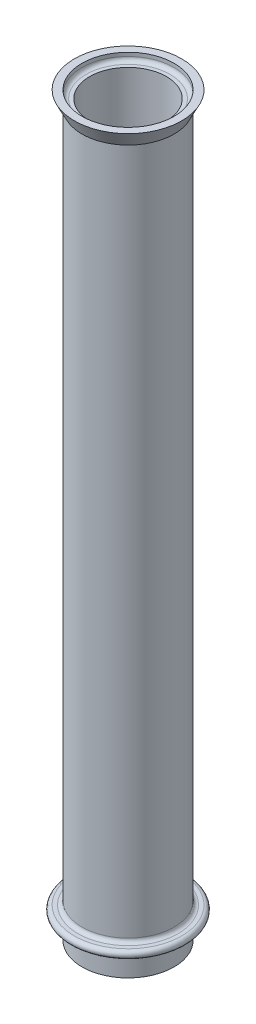
ISO-10303-21;
HEADER;
FILE_DESCRIPTION(('STEP AP214'),'2;1');
FILE_NAME('part.step','',(''),(''),'','','');
FILE_SCHEMA(('AUTOMOTIVE_DESIGN { 1 0 10303 214 1 1 1 1 }'));
ENDSEC;
DATA;
#1=APPLICATION_CONTEXT('core data for automotive mechanical design processes');
#2=APPLICATION_PROTOCOL_DEFINITION('international standard','automotive_design',2000,#1);
#3=PRODUCT_CONTEXT('',#1,'mechanical');
#4=PRODUCT('Part','Part','',(#3));
#5=PRODUCT_RELATED_PRODUCT_CATEGORY('part','',(#4));
#6=PRODUCT_DEFINITION_FORMATION('','',#4);
#7=PRODUCT_DEFINITION_CONTEXT('part definition',#1,'design');
#8=PRODUCT_DEFINITION('design','',#6,#7);
#9=PRODUCT_DEFINITION_SHAPE('','',#8);
#10=(LENGTH_UNIT() NAMED_UNIT(*) SI_UNIT(.MILLI.,.METRE.));
#11=(NAMED_UNIT(*) PLANE_ANGLE_UNIT() SI_UNIT($,.RADIAN.));
#12=(NAMED_UNIT(*) SI_UNIT($,.STERADIAN.) SOLID_ANGLE_UNIT());
#13=UNCERTAINTY_MEASURE_WITH_UNIT(LENGTH_MEASURE(1.E-05),#10,'distance_accuracy_value','');
#14=(GEOMETRIC_REPRESENTATION_CONTEXT(3) GLOBAL_UNCERTAINTY_ASSIGNED_CONTEXT((#13)) GLOBAL_UNIT_ASSIGNED_CONTEXT((#10,
#11,#12)) REPRESENTATION_CONTEXT('',''));
#15=CARTESIAN_POINT('',(0.,0.,0.));
#16=DIRECTION('',(0.,0.,1.));
#17=DIRECTION('',(1.,0.,0.));
#18=AXIS2_PLACEMENT_3D('',#15,#16,#17);
#19=CARTESIAN_POINT('',(-7.9375,150.8125,0.));
#20=DIRECTION('',(0.,-1.,0.));
#21=DIRECTION('',(0.,0.,-1.));
#22=AXIS2_PLACEMENT_3D('',#19,#20,#21);
#23=PLANE('',#22);
#24=CARTESIAN_POINT('',(0.,150.8125,0.));
#25=DIRECTION('',(0.,-1.,0.));
#26=DIRECTION('',(0.,0.,-1.));
#27=AXIS2_PLACEMENT_3D('',#24,#25,#26);
#28=CIRCLE('',#27,8.6995);
#29=CARTESIAN_POINT('',(0.,150.8125,-8.6995));
#30=VERTEX_POINT('',#29);
#31=EDGE_CURVE('E74',#30,#30,#28,.T.);
#32=ORIENTED_EDGE('',*,*,#31,.F.);
#33=EDGE_LOOP('',(#32));
#34=FACE_BOUND('',#33,.T.);
#35=CARTESIAN_POINT('',(0.,150.8125,0.));
#36=DIRECTION('',(0.,-1.,0.));
#37=DIRECTION('',(0.,0.,-1.));
#38=AXIS2_PLACEMENT_3D('',#35,#36,#37);
#39=CIRCLE('',#38,7.9375);
#40=CARTESIAN_POINT('',(0.,150.8125,-7.9375));
#41=VERTEX_POINT('',#40);
#42=EDGE_CURVE('E10',#41,#41,#39,.T.);
#43=ORIENTED_EDGE('',*,*,#42,.T.);
#44=EDGE_LOOP('',(#43));
#45=FACE_BOUND('',#44,.T.);
#46=ADVANCED_FACE('F28',(#34,#45),#23,.F.);
#47=CARTESIAN_POINT('',(0.,0.,0.));
#48=DIRECTION('',(0.,-1.,0.));
#49=DIRECTION('',(0.,0.,-1.));
#50=AXIS2_PLACEMENT_3D('',#47,#48,#49);
#51=CYLINDRICAL_SURFACE('',#50,7.9375);
#52=ORIENTED_EDGE('',*,*,#42,.F.);
#53=EDGE_LOOP('',(#52));
#54=FACE_BOUND('',#53,.T.);
#55=CARTESIAN_POINT('',(0.,0.,0.));
#56=DIRECTION('',(0.,-1.,0.));
#57=DIRECTION('',(0.,0.,-1.));
#58=AXIS2_PLACEMENT_3D('',#55,#56,#57);
#59=CIRCLE('',#58,7.9375);
#60=CARTESIAN_POINT('',(0.,0.,-7.9375));
#61=VERTEX_POINT('',#60);
#62=EDGE_CURVE('E34',#61,#61,#59,.T.);
#63=ORIENTED_EDGE('',*,*,#62,.T.);
#64=EDGE_LOOP('',(#63));
#65=FACE_BOUND('',#64,.T.);
#66=ADVANCED_FACE('F81',(#54,#65),#51,.F.);
#67=CARTESIAN_POINT('',(-7.9375,0.,0.));
#68=DIRECTION('',(0.,1.,0.));
#69=DIRECTION('',(0.,0.,1.));
#70=AXIS2_PLACEMENT_3D('',#67,#68,#69);
#71=PLANE('',#70);
#72=ORIENTED_EDGE('',*,*,#62,.F.);
#73=EDGE_LOOP('',(#72));
#74=FACE_BOUND('',#73,.T.);
#75=CARTESIAN_POINT('',(0.,0.,0.));
#76=DIRECTION('',(0.,-1.,0.));
#77=DIRECTION('',(0.,0.,-1.));
#78=AXIS2_PLACEMENT_3D('',#75,#76,#77);
#79=CIRCLE('',#78,9.525);
#80=CARTESIAN_POINT('',(0.,0.,-9.525));
#81=VERTEX_POINT('',#80);
#82=EDGE_CURVE('E38',#81,#81,#79,.T.);
#83=ORIENTED_EDGE('',*,*,#82,.T.);
#84=EDGE_LOOP('',(#83));
#85=FACE_BOUND('',#84,.T.);
#86=ADVANCED_FACE('F85',(#74,#85),#71,.F.);
#87=CARTESIAN_POINT('',(0.,0.,0.));
#88=DIRECTION('',(0.,-1.,0.));
#89=DIRECTION('',(0.,0.,-1.));
#90=AXIS2_PLACEMENT_3D('',#87,#88,#89);
#91=CYLINDRICAL_SURFACE('',#90,9.525);
#92=ORIENTED_EDGE('',*,*,#82,.F.);
#93=EDGE_LOOP('',(#92));
#94=FACE_BOUND('',#93,.T.);
#95=CARTESIAN_POINT('',(0.,3.96874999999999,0.));
#96=DIRECTION('',(0.,-1.,0.));
#97=DIRECTION('',(0.,0.,-1.));
#98=AXIS2_PLACEMENT_3D('',#95,#96,#97);
#99=CIRCLE('',#98,9.525);
#100=CARTESIAN_POINT('',(0.,3.96874999999999,-9.525));
#101=VERTEX_POINT('',#100);
#102=EDGE_CURVE('E42',#101,#101,#99,.T.);
#103=ORIENTED_EDGE('',*,*,#102,.T.);
#104=EDGE_LOOP('',(#103));
#105=FACE_BOUND('',#104,.T.);
#106=ADVANCED_FACE('F90',(#94,#105),#91,.T.);
#107=CARTESIAN_POINT('',(0.,3.96875,0.));
#108=DIRECTION('',(0.,-1.,0.));
#109=DIRECTION('',(0.,0.,-1.));
#110=AXIS2_PLACEMENT_3D('',#107,#108,#109);
#111=TOROIDAL_SURFACE('',#110,10.31875,0.793749999999999);
#112=ORIENTED_EDGE('',*,*,#102,.F.);
#113=EDGE_LOOP('',(#112));
#114=FACE_BOUND('',#113,.T.);
#115=CARTESIAN_POINT('',(0.,4.7625,0.));
#116=DIRECTION('',(0.,-1.,0.));
#117=DIRECTION('',(0.,0.,-1.));
#118=AXIS2_PLACEMENT_3D('',#115,#116,#117);
#119=CIRCLE('',#118,10.31875);
#120=CARTESIAN_POINT('',(0.,4.7625,-10.31875));
#121=VERTEX_POINT('',#120);
#122=EDGE_CURVE('E47',#121,#121,#119,.T.);
#123=ORIENTED_EDGE('',*,*,#122,.T.);
#124=EDGE_LOOP('',(#123));
#125=FACE_BOUND('',#124,.T.);
#126=ADVANCED_FACE('F96',(#114,#125),#111,.F.);
#127=CARTESIAN_POINT('',(-10.31875,4.7625,0.));
#128=DIRECTION('',(0.,1.,0.));
#129=DIRECTION('',(0.,0.,1.));
#130=AXIS2_PLACEMENT_3D('',#127,#128,#129);
#131=PLANE('',#130);
#132=ORIENTED_EDGE('',*,*,#122,.F.);
#133=EDGE_LOOP('',(#132));
#134=FACE_BOUND('',#133,.T.);
#135=CARTESIAN_POINT('',(0.,4.7625,0.));
#136=DIRECTION('',(0.,-1.,0.));
#137=DIRECTION('',(0.,0.,-1.));
#138=AXIS2_PLACEMENT_3D('',#135,#136,#137);
#139=CIRCLE('',#138,11.1125);
#140=CARTESIAN_POINT('',(0.,4.7625,-11.1125));
#141=VERTEX_POINT('',#140);
#142=EDGE_CURVE('E50',#141,#141,#139,.T.);
#143=ORIENTED_EDGE('',*,*,#142,.T.);
#144=EDGE_LOOP('',(#143));
#145=FACE_BOUND('',#144,.T.);
#146=ADVANCED_FACE('F100',(#134,#145),#131,.F.);
#147=CARTESIAN_POINT('',(0.,5.55625,0.));
#148=DIRECTION('',(0.,-1.,0.));
#149=DIRECTION('',(0.,0.,-1.));
#150=AXIS2_PLACEMENT_3D('',#147,#148,#149);
#151=TOROIDAL_SURFACE('',#150,11.1125,0.79375);
#152=ORIENTED_EDGE('',*,*,#142,.F.);
#153=EDGE_LOOP('',(#152));
#154=FACE_BOUND('',#153,.T.);
#155=CARTESIAN_POINT('',(0.,6.35,0.));
#156=DIRECTION('',(0.,-1.,0.));
#157=DIRECTION('',(0.,0.,-1.));
#158=AXIS2_PLACEMENT_3D('',#155,#156,#157);
#159=CIRCLE('',#158,11.1125);
#160=CARTESIAN_POINT('',(0.,6.35,-11.1125));
#161=VERTEX_POINT('',#160);
#162=EDGE_CURVE('E53',#161,#161,#159,.T.);
#163=ORIENTED_EDGE('',*,*,#162,.T.);
#164=EDGE_LOOP('',(#163));
#165=FACE_BOUND('',#164,.T.);
#166=ADVANCED_FACE('F104',(#154,#165),#151,.T.);
#167=CARTESIAN_POINT('',(-11.1125,6.35,0.));
#168=DIRECTION('',(0.,-1.,0.));
#169=DIRECTION('',(0.,0.,-1.));
#170=AXIS2_PLACEMENT_3D('',#167,#168,#169);
#171=PLANE('',#170);
#172=ORIENTED_EDGE('',*,*,#162,.F.);
#173=EDGE_LOOP('',(#172));
#174=FACE_BOUND('',#173,.T.);
#175=CARTESIAN_POINT('',(0.,6.35,0.));
#176=DIRECTION('',(0.,-1.,0.));
#177=DIRECTION('',(0.,0.,-1.));
#178=AXIS2_PLACEMENT_3D('',#175,#176,#177);
#179=CIRCLE('',#178,10.31875);
#180=CARTESIAN_POINT('',(0.,6.35,-10.31875));
#181=VERTEX_POINT('',#180);
#182=EDGE_CURVE('E56',#181,#181,#179,.T.);
#183=ORIENTED_EDGE('',*,*,#182,.T.);
#184=EDGE_LOOP('',(#183));
#185=FACE_BOUND('',#184,.T.);
#186=ADVANCED_FACE('F108',(#174,#185),#171,.F.);
#187=CARTESIAN_POINT('',(0.,7.14375,0.));
#188=DIRECTION('',(0.,-1.,0.));
#189=DIRECTION('',(0.,0.,-1.));
#190=AXIS2_PLACEMENT_3D('',#187,#188,#189);
#191=TOROIDAL_SURFACE('',#190,10.31875,0.793749999999999);
#192=ORIENTED_EDGE('',*,*,#182,.F.);
#193=EDGE_LOOP('',(#192));
#194=FACE_BOUND('',#193,.T.);
#195=CARTESIAN_POINT('',(0.,7.14375,0.));
#196=DIRECTION('',(0.,-1.,0.));
#197=DIRECTION('',(0.,0.,-1.));
#198=AXIS2_PLACEMENT_3D('',#195,#196,#197);
#199=CIRCLE('',#198,9.525);
#200=CARTESIAN_POINT('',(0.,7.14375,-9.525));
#201=VERTEX_POINT('',#200);
#202=EDGE_CURVE('E59',#201,#201,#199,.T.);
#203=ORIENTED_EDGE('',*,*,#202,.T.);
#204=EDGE_LOOP('',(#203));
#205=FACE_BOUND('',#204,.T.);
#206=ADVANCED_FACE('F112',(#194,#205),#191,.F.);
#207=CARTESIAN_POINT('',(0.,0.,0.));
#208=DIRECTION('',(0.,-1.,0.));
#209=DIRECTION('',(0.,0.,-1.));
#210=AXIS2_PLACEMENT_3D('',#207,#208,#209);
#211=CYLINDRICAL_SURFACE('',#210,9.525);
#212=ORIENTED_EDGE('',*,*,#202,.F.);
#213=EDGE_LOOP('',(#212));
#214=FACE_BOUND('',#213,.T.);
#215=CARTESIAN_POINT('',(0.,149.225,0.));
#216=DIRECTION('',(0.,-1.,0.));
#217=DIRECTION('',(0.,0.,-1.));
#218=AXIS2_PLACEMENT_3D('',#215,#216,#217);
#219=CIRCLE('',#218,9.525);
#220=CARTESIAN_POINT('',(0.,149.225,-9.525));
#221=VERTEX_POINT('',#220);
#222=EDGE_CURVE('E62',#221,#221,#219,.T.);
#223=ORIENTED_EDGE('',*,*,#222,.T.);
#224=EDGE_LOOP('',(#223));
#225=FACE_BOUND('',#224,.T.);
#226=ADVANCED_FACE('F116',(#214,#225),#211,.T.);
#227=CARTESIAN_POINT('',(0.,152.4,0.));
#228=DIRECTION('',(0.,1.,0.));
#229=DIRECTION('',(0.,0.,1.));
#230=AXIS2_PLACEMENT_3D('',#227,#228,#229);
#231=CONICAL_SURFACE('',#230,11.1125,0.463647609000804);
#232=ORIENTED_EDGE('',*,*,#222,.F.);
#233=EDGE_LOOP('',(#232));
#234=FACE_BOUND('',#233,.T.);
#235=CARTESIAN_POINT('',(0.,152.4,0.));
#236=DIRECTION('',(0.,-1.,0.));
#237=DIRECTION('',(0.,0.,-1.));
#238=AXIS2_PLACEMENT_3D('',#235,#236,#237);
#239=CIRCLE('',#238,11.1125);
#240=CARTESIAN_POINT('',(0.,152.4,-11.1125));
#241=VERTEX_POINT('',#240);
#242=EDGE_CURVE('E65',#241,#241,#239,.T.);
#243=ORIENTED_EDGE('',*,*,#242,.T.);
#244=EDGE_LOOP('',(#243));
#245=FACE_BOUND('',#244,.T.);
#246=ADVANCED_FACE('F120',(#234,#245),#231,.T.);
#247=CARTESIAN_POINT('',(-11.1125,152.4,0.));
#248=DIRECTION('',(0.,-1.,0.));
#249=DIRECTION('',(0.,0.,-1.));
#250=AXIS2_PLACEMENT_3D('',#247,#248,#249);
#251=PLANE('',#250);
#252=ORIENTED_EDGE('',*,*,#242,.F.);
#253=EDGE_LOOP('',(#252));
#254=FACE_BOUND('',#253,.T.);
#255=CARTESIAN_POINT('',(0.,152.4,0.));
#256=DIRECTION('',(0.,-1.,0.));
#257=DIRECTION('',(0.,0.,-1.));
#258=AXIS2_PLACEMENT_3D('',#255,#256,#257);
#259=CIRCLE('',#258,9.525);
#260=CARTESIAN_POINT('',(0.,152.4,-9.525));
#261=VERTEX_POINT('',#260);
#262=EDGE_CURVE('E68',#261,#261,#259,.T.);
#263=ORIENTED_EDGE('',*,*,#262,.T.);
#264=EDGE_LOOP('',(#263));
#265=FACE_BOUND('',#264,.T.);
#266=ADVANCED_FACE('F124',(#254,#265),#251,.F.);
#267=CARTESIAN_POINT('',(0.,0.,0.));
#268=DIRECTION('',(0.,-1.,0.));
#269=DIRECTION('',(0.,0.,-1.));
#270=AXIS2_PLACEMENT_3D('',#267,#268,#269);
#271=CYLINDRICAL_SURFACE('',#270,9.525);
#272=ORIENTED_EDGE('',*,*,#262,.F.);
#273=EDGE_LOOP('',(#272));
#274=FACE_BOUND('',#273,.T.);
#275=CARTESIAN_POINT('',(0.,151.638,0.));
#276=DIRECTION('',(0.,-1.,0.));
#277=DIRECTION('',(0.,0.,-1.));
#278=AXIS2_PLACEMENT_3D('',#275,#276,#277);
#279=CIRCLE('',#278,9.525);
#280=CARTESIAN_POINT('',(0.,151.638,-9.525));
#281=VERTEX_POINT('',#280);
#282=EDGE_CURVE('E71',#281,#281,#279,.T.);
#283=ORIENTED_EDGE('',*,*,#282,.T.);
#284=EDGE_LOOP('',(#283));
#285=FACE_BOUND('',#284,.T.);
#286=ADVANCED_FACE('F128',(#274,#285),#271,.F.);
#287=CARTESIAN_POINT('',(0.,151.638,0.));
#288=DIRECTION('',(0.,-1.,0.));
#289=DIRECTION('',(0.,0.,-1.));
#290=AXIS2_PLACEMENT_3D('',#287,#288,#289);
#291=TOROIDAL_SURFACE('',#290,8.6995,0.825500000000017);
#292=ORIENTED_EDGE('',*,*,#282,.F.);
#293=EDGE_LOOP('',(#292));
#294=FACE_BOUND('',#293,.T.);
#295=ORIENTED_EDGE('',*,*,#31,.T.);
#296=EDGE_LOOP('',(#295));
#297=FACE_BOUND('',#296,.T.);
#298=ADVANCED_FACE('F78',(#294,#297),#291,.F.);
#299=CLOSED_SHELL('',(#46,#66,#86,#106,#126,#146,#166,#186,#206,#226,#246,#266,#286,#298));
#300=MANIFOLD_SOLID_BREP('B2',#299);
#301=ADVANCED_BREP_SHAPE_REPRESENTATION('',(#18,#300),#14);
#302=SHAPE_DEFINITION_REPRESENTATION(#9,#301);
ENDSEC;
END-ISO-10303-21;
